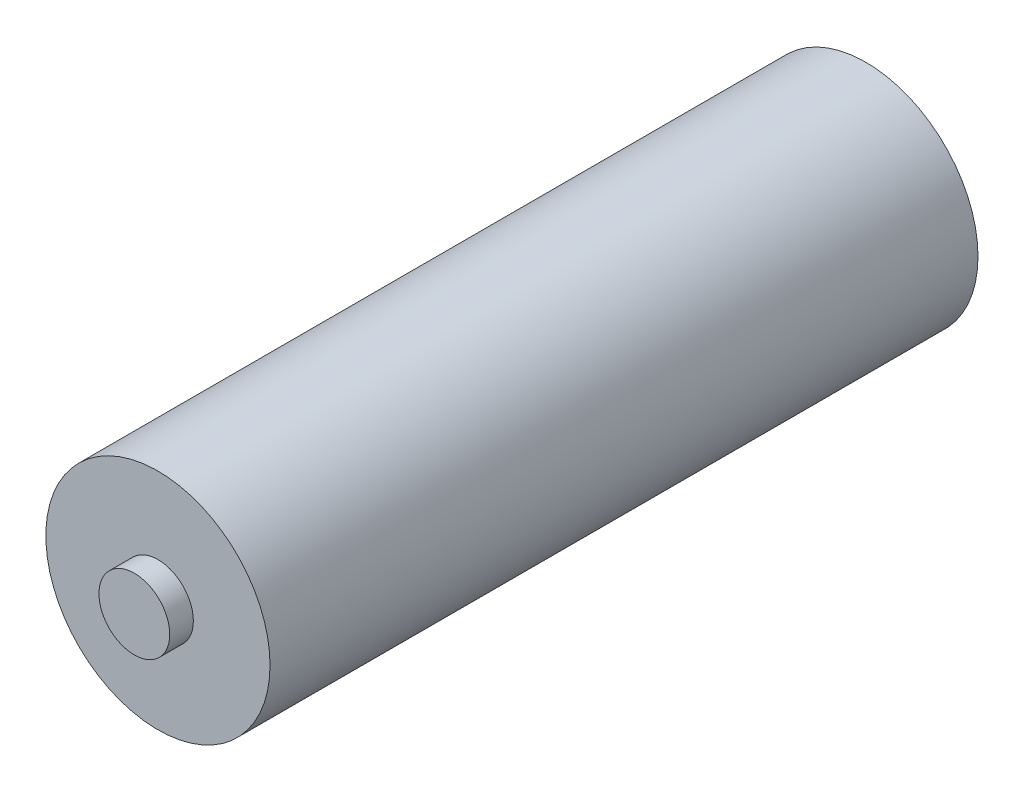
ISO-10303-21;
HEADER;
FILE_DESCRIPTION(('STEP AP214'),'2;1');
FILE_NAME('part.step','',(''),(''),'','','');
FILE_SCHEMA(('AUTOMOTIVE_DESIGN { 1 0 10303 214 1 1 1 1 }'));
ENDSEC;
DATA;
#1=APPLICATION_CONTEXT('core data for automotive mechanical design processes');
#2=APPLICATION_PROTOCOL_DEFINITION('international standard','automotive_design',2000,#1);
#3=PRODUCT_CONTEXT('',#1,'mechanical');
#4=PRODUCT('Part','Part','',(#3));
#5=PRODUCT_RELATED_PRODUCT_CATEGORY('part','',(#4));
#6=PRODUCT_DEFINITION_FORMATION('','',#4);
#7=PRODUCT_DEFINITION_CONTEXT('part definition',#1,'design');
#8=PRODUCT_DEFINITION('design','',#6,#7);
#9=PRODUCT_DEFINITION_SHAPE('','',#8);
#10=(LENGTH_UNIT() NAMED_UNIT(*) SI_UNIT(.MILLI.,.METRE.));
#11=(NAMED_UNIT(*) PLANE_ANGLE_UNIT() SI_UNIT($,.RADIAN.));
#12=(NAMED_UNIT(*) SI_UNIT($,.STERADIAN.) SOLID_ANGLE_UNIT());
#13=UNCERTAINTY_MEASURE_WITH_UNIT(LENGTH_MEASURE(1.E-05),#10,'distance_accuracy_value','');
#14=(GEOMETRIC_REPRESENTATION_CONTEXT(3) GLOBAL_UNCERTAINTY_ASSIGNED_CONTEXT((#13)) GLOBAL_UNIT_ASSIGNED_CONTEXT((#10,
#11,#12)) REPRESENTATION_CONTEXT('',''));
#15=CARTESIAN_POINT('',(0.,0.,0.));
#16=DIRECTION('',(0.,0.,1.));
#17=DIRECTION('',(1.,0.,0.));
#18=AXIS2_PLACEMENT_3D('',#15,#16,#17);
#19=CARTESIAN_POINT('',(0.,0.,150.));
#20=DIRECTION('',(0.,0.,-1.));
#21=DIRECTION('',(-1.,0.,0.));
#22=AXIS2_PLACEMENT_3D('',#19,#20,#21);
#23=CYLINDRICAL_SURFACE('',#22,47.5);
#24=CARTESIAN_POINT('',(0.,0.,150.));
#25=DIRECTION('',(0.,0.,1.));
#26=DIRECTION('',(1.,0.,0.));
#27=AXIS2_PLACEMENT_3D('',#24,#25,#26);
#28=CIRCLE('',#27,47.5);
#29=CARTESIAN_POINT('',(47.5,0.,150.));
#30=VERTEX_POINT('',#29);
#31=EDGE_CURVE('E51',#30,#30,#28,.T.);
#32=ORIENTED_EDGE('',*,*,#31,.F.);
#33=EDGE_LOOP('',(#32));
#34=FACE_BOUND('',#33,.T.);
#35=CARTESIAN_POINT('',(0.,0.,-150.));
#36=DIRECTION('',(0.,0.,1.));
#37=DIRECTION('',(1.,0.,0.));
#38=AXIS2_PLACEMENT_3D('',#35,#36,#37);
#39=CIRCLE('',#38,47.5);
#40=CARTESIAN_POINT('',(47.5,0.,-150.));
#41=VERTEX_POINT('',#40);
#42=EDGE_CURVE('E57',#41,#41,#39,.T.);
#43=ORIENTED_EDGE('',*,*,#42,.T.);
#44=EDGE_LOOP('',(#43));
#45=FACE_BOUND('',#44,.T.);
#46=ADVANCED_FACE('F43',(#34,#45),#23,.T.);
#47=CARTESIAN_POINT('',(0.,0.,150.));
#48=DIRECTION('',(0.,0.,1.));
#49=DIRECTION('',(1.,0.,0.));
#50=AXIS2_PLACEMENT_3D('',#47,#48,#49);
#51=PLANE('',#50);
#52=CARTESIAN_POINT('',(0.,0.,150.));
#53=DIRECTION('',(0.,0.,1.));
#54=DIRECTION('',(1.,0.,0.));
#55=AXIS2_PLACEMENT_3D('',#52,#53,#54);
#56=CIRCLE('',#55,15.);
#57=CARTESIAN_POINT('',(15.,0.,150.));
#58=VERTEX_POINT('',#57);
#59=EDGE_CURVE('E10',#58,#58,#56,.T.);
#60=ORIENTED_EDGE('',*,*,#59,.F.);
#61=EDGE_LOOP('',(#60));
#62=FACE_BOUND('',#61,.T.);
#63=ORIENTED_EDGE('',*,*,#31,.T.);
#64=EDGE_LOOP('',(#63));
#65=FACE_BOUND('',#64,.T.);
#66=ADVANCED_FACE('F94',(#62,#65),#51,.T.);
#67=CARTESIAN_POINT('',(0.,0.,-150.));
#68=DIRECTION('',(0.,0.,1.));
#69=DIRECTION('',(1.,0.,0.));
#70=AXIS2_PLACEMENT_3D('',#67,#68,#69);
#71=PLANE('',#70);
#72=CARTESIAN_POINT('',(0.,0.,-150.));
#73=DIRECTION('',(0.,0.,1.));
#74=DIRECTION('',(1.,0.,0.));
#75=AXIS2_PLACEMENT_3D('',#72,#73,#74);
#76=CIRCLE('',#75,15.);
#77=CARTESIAN_POINT('',(15.,0.,-150.));
#78=VERTEX_POINT('',#77);
#79=EDGE_CURVE('E46',#78,#78,#76,.T.);
#80=ORIENTED_EDGE('',*,*,#79,.T.);
#81=EDGE_LOOP('',(#80));
#82=FACE_BOUND('',#81,.T.);
#83=ORIENTED_EDGE('',*,*,#42,.F.);
#84=EDGE_LOOP('',(#83));
#85=FACE_BOUND('',#84,.T.);
#86=ADVANCED_FACE('F99',(#82,#85),#71,.F.);
#87=CARTESIAN_POINT('',(0.,0.,-160.));
#88=DIRECTION('',(0.,0.,1.));
#89=DIRECTION('',(1.,0.,0.));
#90=AXIS2_PLACEMENT_3D('',#87,#88,#89);
#91=PLANE('',#90);
#92=CARTESIAN_POINT('',(0.,0.,-160.));
#93=DIRECTION('',(0.,0.,1.));
#94=DIRECTION('',(1.,0.,0.));
#95=AXIS2_PLACEMENT_3D('',#92,#93,#94);
#96=CIRCLE('',#95,15.);
#97=CARTESIAN_POINT('',(15.,0.,-160.));
#98=VERTEX_POINT('',#97);
#99=EDGE_CURVE('E60',#98,#98,#96,.T.);
#100=ORIENTED_EDGE('',*,*,#99,.F.);
#101=EDGE_LOOP('',(#100));
#102=FACE_BOUND('',#101,.T.);
#103=ADVANCED_FACE('F90',(#102),#91,.F.);
#104=CARTESIAN_POINT('',(0.,0.,-160.));
#105=DIRECTION('',(0.,0.,1.));
#106=DIRECTION('',(1.,0.,0.));
#107=AXIS2_PLACEMENT_3D('',#104,#105,#106);
#108=CYLINDRICAL_SURFACE('',#107,15.);
#109=ORIENTED_EDGE('',*,*,#99,.T.);
#110=EDGE_LOOP('',(#109));
#111=FACE_BOUND('',#110,.T.);
#112=ORIENTED_EDGE('',*,*,#79,.F.);
#113=EDGE_LOOP('',(#112));
#114=FACE_BOUND('',#113,.T.);
#115=ADVANCED_FACE('F83',(#111,#114),#108,.T.);
#116=ORIENTED_EDGE('',*,*,#59,.T.);
#117=EDGE_LOOP('',(#116));
#118=FACE_BOUND('',#117,.T.);
#119=CARTESIAN_POINT('',(0.,0.,160.));
#120=DIRECTION('',(0.,0.,1.));
#121=DIRECTION('',(1.,0.,0.));
#122=AXIS2_PLACEMENT_3D('',#119,#120,#121);
#123=CIRCLE('',#122,15.);
#124=CARTESIAN_POINT('',(15.,0.,160.));
#125=VERTEX_POINT('',#124);
#126=EDGE_CURVE('E72',#125,#125,#123,.T.);
#127=ORIENTED_EDGE('',*,*,#126,.F.);
#128=EDGE_LOOP('',(#127));
#129=FACE_BOUND('',#128,.T.);
#130=ADVANCED_FACE('F81',(#118,#129),#108,.T.);
#131=CARTESIAN_POINT('',(0.,0.,160.));
#132=DIRECTION('',(0.,0.,1.));
#133=DIRECTION('',(1.,0.,0.));
#134=AXIS2_PLACEMENT_3D('',#131,#132,#133);
#135=PLANE('',#134);
#136=ORIENTED_EDGE('',*,*,#126,.T.);
#137=EDGE_LOOP('',(#136));
#138=FACE_BOUND('',#137,.T.);
#139=ADVANCED_FACE('F79',(#138),#135,.T.);
#140=CLOSED_SHELL('',(#46,#66,#86,#103,#115,#130,#139));
#141=MANIFOLD_SOLID_BREP('B2',#140);
#142=ADVANCED_BREP_SHAPE_REPRESENTATION('',(#18,#141),#14);
#143=SHAPE_DEFINITION_REPRESENTATION(#9,#142);
ENDSEC;
END-ISO-10303-21;
